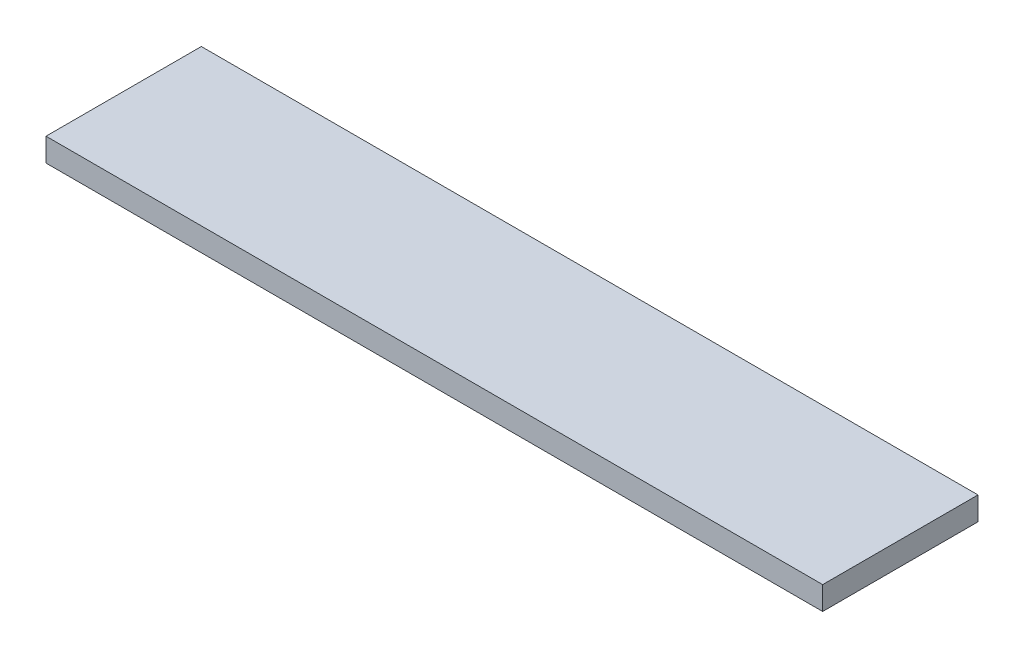
ISO-10303-21;
HEADER;
FILE_DESCRIPTION(('STEP AP214'),'2;1');
FILE_NAME('part.step','',(''),(''),'','','');
FILE_SCHEMA(('AUTOMOTIVE_DESIGN { 1 0 10303 214 1 1 1 1 }'));
ENDSEC;
DATA;
#1=APPLICATION_CONTEXT('core data for automotive mechanical design processes');
#2=APPLICATION_PROTOCOL_DEFINITION('international standard','automotive_design',2000,#1);
#3=PRODUCT_CONTEXT('',#1,'mechanical');
#4=PRODUCT('Part','Part','',(#3));
#5=PRODUCT_RELATED_PRODUCT_CATEGORY('part','',(#4));
#6=PRODUCT_DEFINITION_FORMATION('','',#4);
#7=PRODUCT_DEFINITION_CONTEXT('part definition',#1,'design');
#8=PRODUCT_DEFINITION('design','',#6,#7);
#9=PRODUCT_DEFINITION_SHAPE('','',#8);
#10=(LENGTH_UNIT() NAMED_UNIT(*) SI_UNIT(.MILLI.,.METRE.));
#11=(NAMED_UNIT(*) PLANE_ANGLE_UNIT() SI_UNIT($,.RADIAN.));
#12=(NAMED_UNIT(*) SI_UNIT($,.STERADIAN.) SOLID_ANGLE_UNIT());
#13=UNCERTAINTY_MEASURE_WITH_UNIT(LENGTH_MEASURE(1.E-05),#10,'distance_accuracy_value','');
#14=(GEOMETRIC_REPRESENTATION_CONTEXT(3) GLOBAL_UNCERTAINTY_ASSIGNED_CONTEXT((#13)) GLOBAL_UNIT_ASSIGNED_CONTEXT((#10,
#11,#12)) REPRESENTATION_CONTEXT('',''));
#15=CARTESIAN_POINT('',(0.,0.,0.));
#16=DIRECTION('',(0.,0.,1.));
#17=DIRECTION('',(1.,0.,0.));
#18=AXIS2_PLACEMENT_3D('',#15,#16,#17);
#19=CARTESIAN_POINT('',(55.0805949248052,3.,9.8204367370871));
#20=DIRECTION('',(0.,0.,1.));
#21=DIRECTION('',(1.,0.,0.));
#22=AXIS2_PLACEMENT_3D('',#19,#20,#21);
#23=PLANE('',#22);
#24=DIRECTION('',(-1.,0.,0.));
#25=VECTOR('',#24,1.);
#26=CARTESIAN_POINT('',(55.0805949248052,0.,9.8204367370871));
#27=LINE('',#26,#25);
#28=CARTESIAN_POINT('',(55.0805949248052,0.,9.8204367370871));
#29=VERTEX_POINT('',#28);
#30=CARTESIAN_POINT('',(-44.9194050751948,0.,9.82043673708712));
#31=VERTEX_POINT('',#30);
#32=EDGE_CURVE('E115',#29,#31,#27,.T.);
#33=ORIENTED_EDGE('',*,*,#32,.F.);
#34=DIRECTION('',(0.,-1.,0.));
#35=VECTOR('',#34,1.);
#36=CARTESIAN_POINT('',(55.0805949248052,3.,9.8204367370871));
#37=LINE('',#36,#35);
#38=CARTESIAN_POINT('',(55.0805949248052,3.,9.8204367370871));
#39=VERTEX_POINT('',#38);
#40=EDGE_CURVE('E11',#39,#29,#37,.T.);
#41=ORIENTED_EDGE('',*,*,#40,.F.);
#42=DIRECTION('',(-1.,0.,0.));
#43=VECTOR('',#42,1.);
#44=CARTESIAN_POINT('',(55.0805949248052,3.,9.8204367370871));
#45=LINE('',#44,#43);
#46=CARTESIAN_POINT('',(-44.9194050751948,3.,9.82043673708712));
#47=VERTEX_POINT('',#46);
#48=EDGE_CURVE('E107',#39,#47,#45,.T.);
#49=ORIENTED_EDGE('',*,*,#48,.T.);
#50=DIRECTION('',(0.,-1.,0.));
#51=VECTOR('',#50,1.);
#52=CARTESIAN_POINT('',(-44.9194050751948,3.,9.82043673708712));
#53=LINE('',#52,#51);
#54=EDGE_CURVE('E48',#47,#31,#53,.T.);
#55=ORIENTED_EDGE('',*,*,#54,.T.);
#56=EDGE_LOOP('',(#33,#41,#49,#55));
#57=FACE_BOUND('',#56,.T.);
#58=ADVANCED_FACE('F45',(#57),#23,.T.);
#59=CARTESIAN_POINT('',(55.0805949248052,3.,-10.1795632629129));
#60=DIRECTION('',(1.,0.,0.));
#61=DIRECTION('',(0.,0.,-1.));
#62=AXIS2_PLACEMENT_3D('',#59,#60,#61);
#63=PLANE('',#62);
#64=DIRECTION('',(0.,0.,1.));
#65=VECTOR('',#64,1.);
#66=CARTESIAN_POINT('',(55.0805949248052,0.,-10.1795632629129));
#67=LINE('',#66,#65);
#68=CARTESIAN_POINT('',(55.0805949248052,0.,-10.1795632629129));
#69=VERTEX_POINT('',#68);
#70=EDGE_CURVE('E110',#69,#29,#67,.T.);
#71=ORIENTED_EDGE('',*,*,#70,.F.);
#72=DIRECTION('',(0.,-1.,0.));
#73=VECTOR('',#72,1.);
#74=CARTESIAN_POINT('',(55.0805949248052,3.,-10.1795632629129));
#75=LINE('',#74,#73);
#76=CARTESIAN_POINT('',(55.0805949248052,3.,-10.1795632629129));
#77=VERTEX_POINT('',#76);
#78=EDGE_CURVE('E55',#77,#69,#75,.T.);
#79=ORIENTED_EDGE('',*,*,#78,.F.);
#80=DIRECTION('',(0.,0.,1.));
#81=VECTOR('',#80,1.);
#82=CARTESIAN_POINT('',(55.0805949248052,3.,-10.1795632629129));
#83=LINE('',#82,#81);
#84=EDGE_CURVE('E102',#77,#39,#83,.T.);
#85=ORIENTED_EDGE('',*,*,#84,.T.);
#86=ORIENTED_EDGE('',*,*,#40,.T.);
#87=EDGE_LOOP('',(#71,#79,#85,#86));
#88=FACE_BOUND('',#87,.T.);
#89=ADVANCED_FACE('F131',(#88),#63,.T.);
#90=CARTESIAN_POINT('',(-44.9194050751948,3.,-10.1795632629129));
#91=DIRECTION('',(0.,0.,-1.));
#92=DIRECTION('',(-1.,0.,0.));
#93=AXIS2_PLACEMENT_3D('',#90,#91,#92);
#94=PLANE('',#93);
#95=DIRECTION('',(1.,0.,0.));
#96=VECTOR('',#95,1.);
#97=CARTESIAN_POINT('',(-44.9194050751948,0.,-10.1795632629129));
#98=LINE('',#97,#96);
#99=CARTESIAN_POINT('',(-44.9194050751948,0.,-10.1795632629129));
#100=VERTEX_POINT('',#99);
#101=EDGE_CURVE('E96',#100,#69,#98,.T.);
#102=ORIENTED_EDGE('',*,*,#101,.F.);
#103=DIRECTION('',(0.,-1.,0.));
#104=VECTOR('',#103,1.);
#105=CARTESIAN_POINT('',(-44.9194050751948,3.,-10.1795632629129));
#106=LINE('',#105,#104);
#107=CARTESIAN_POINT('',(-44.9194050751948,3.,-10.1795632629129));
#108=VERTEX_POINT('',#107);
#109=EDGE_CURVE('E91',#108,#100,#106,.T.);
#110=ORIENTED_EDGE('',*,*,#109,.F.);
#111=DIRECTION('',(1.,0.,0.));
#112=VECTOR('',#111,1.);
#113=CARTESIAN_POINT('',(-44.9194050751948,3.,-10.1795632629129));
#114=LINE('',#113,#112);
#115=EDGE_CURVE('E94',#108,#77,#114,.T.);
#116=ORIENTED_EDGE('',*,*,#115,.T.);
#117=ORIENTED_EDGE('',*,*,#78,.T.);
#118=EDGE_LOOP('',(#102,#110,#116,#117));
#119=FACE_BOUND('',#118,.T.);
#120=ADVANCED_FACE('F93',(#119),#94,.T.);
#121=CARTESIAN_POINT('',(-44.9194050751948,3.,9.82043673708712));
#122=DIRECTION('',(-1.,0.,0.));
#123=DIRECTION('',(0.,0.,1.));
#124=AXIS2_PLACEMENT_3D('',#121,#122,#123);
#125=PLANE('',#124);
#126=DIRECTION('',(0.,0.,-1.));
#127=VECTOR('',#126,1.);
#128=CARTESIAN_POINT('',(-44.9194050751948,0.,9.82043673708712));
#129=LINE('',#128,#127);
#130=EDGE_CURVE('E119',#31,#100,#129,.T.);
#131=ORIENTED_EDGE('',*,*,#130,.F.);
#132=ORIENTED_EDGE('',*,*,#54,.F.);
#133=DIRECTION('',(0.,0.,-1.));
#134=VECTOR('',#133,1.);
#135=CARTESIAN_POINT('',(-44.9194050751948,3.,9.82043673708712));
#136=LINE('',#135,#134);
#137=EDGE_CURVE('E101',#47,#108,#136,.T.);
#138=ORIENTED_EDGE('',*,*,#137,.T.);
#139=ORIENTED_EDGE('',*,*,#109,.T.);
#140=EDGE_LOOP('',(#131,#132,#138,#139));
#141=FACE_BOUND('',#140,.T.);
#142=ADVANCED_FACE('F105',(#141),#125,.T.);
#143=CARTESIAN_POINT('',(0.,3.,0.));
#144=DIRECTION('',(0.,-1.,0.));
#145=DIRECTION('',(0.,0.,-1.));
#146=AXIS2_PLACEMENT_3D('',#143,#144,#145);
#147=PLANE('',#146);
#148=ORIENTED_EDGE('',*,*,#48,.F.);
#149=ORIENTED_EDGE('',*,*,#84,.F.);
#150=ORIENTED_EDGE('',*,*,#115,.F.);
#151=ORIENTED_EDGE('',*,*,#137,.F.);
#152=EDGE_LOOP('',(#148,#149,#150,#151));
#153=FACE_BOUND('',#152,.T.);
#154=ADVANCED_FACE('F100',(#153),#147,.F.);
#155=CARTESIAN_POINT('',(0.,0.,0.));
#156=DIRECTION('',(0.,-1.,0.));
#157=DIRECTION('',(0.,0.,-1.));
#158=AXIS2_PLACEMENT_3D('',#155,#156,#157);
#159=PLANE('',#158);
#160=ORIENTED_EDGE('',*,*,#32,.T.);
#161=ORIENTED_EDGE('',*,*,#130,.T.);
#162=ORIENTED_EDGE('',*,*,#101,.T.);
#163=ORIENTED_EDGE('',*,*,#70,.T.);
#164=EDGE_LOOP('',(#160,#161,#162,#163));
#165=FACE_BOUND('',#164,.T.);
#166=ADVANCED_FACE('F130',(#165),#159,.T.);
#167=CLOSED_SHELL('',(#58,#89,#120,#142,#154,#166));
#168=MANIFOLD_SOLID_BREP('B2',#167);
#169=ADVANCED_BREP_SHAPE_REPRESENTATION('',(#18,#168),#14);
#170=SHAPE_DEFINITION_REPRESENTATION(#9,#169);
ENDSEC;
END-ISO-10303-21;
